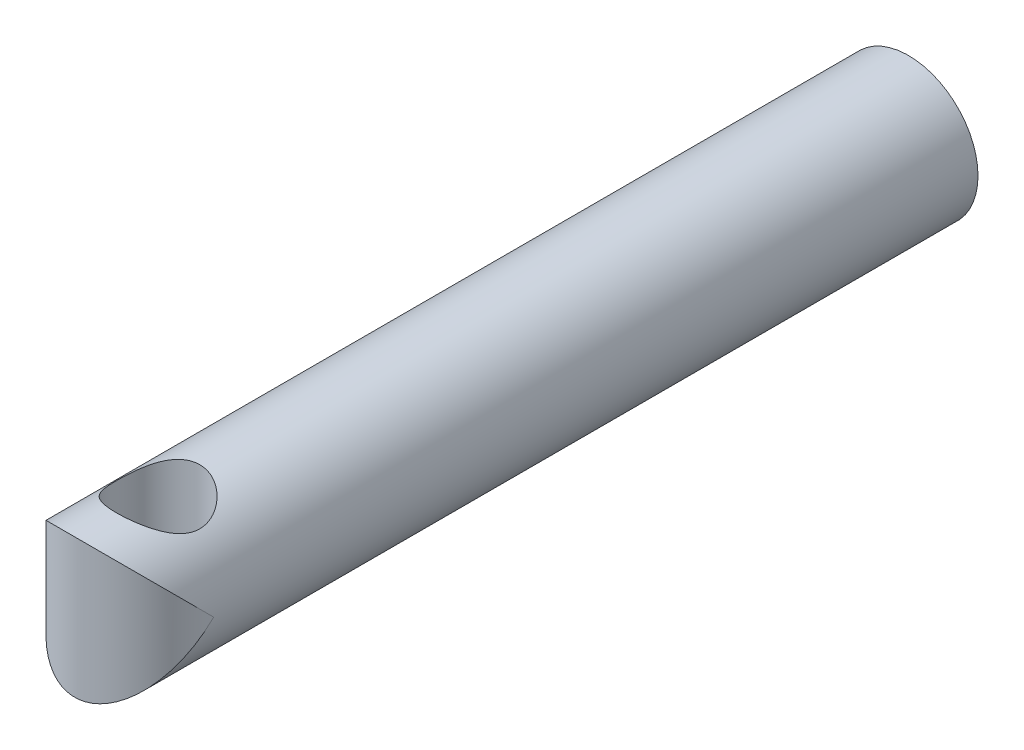
ISO-10303-21;
HEADER;
FILE_DESCRIPTION(('STEP AP214'),'2;1');
FILE_NAME('part.step','',(''),(''),'','','');
FILE_SCHEMA(('AUTOMOTIVE_DESIGN { 1 0 10303 214 1 1 1 1 }'));
ENDSEC;
DATA;
#1=APPLICATION_CONTEXT('core data for automotive mechanical design processes');
#2=APPLICATION_PROTOCOL_DEFINITION('international standard','automotive_design',2000,#1);
#3=PRODUCT_CONTEXT('',#1,'mechanical');
#4=PRODUCT('Part','Part','',(#3));
#5=PRODUCT_RELATED_PRODUCT_CATEGORY('part','',(#4));
#6=PRODUCT_DEFINITION_FORMATION('','',#4);
#7=PRODUCT_DEFINITION_CONTEXT('part definition',#1,'design');
#8=PRODUCT_DEFINITION('design','',#6,#7);
#9=PRODUCT_DEFINITION_SHAPE('','',#8);
#10=(LENGTH_UNIT() NAMED_UNIT(*) SI_UNIT(.MILLI.,.METRE.));
#11=(NAMED_UNIT(*) PLANE_ANGLE_UNIT() SI_UNIT($,.RADIAN.));
#12=(NAMED_UNIT(*) SI_UNIT($,.STERADIAN.) SOLID_ANGLE_UNIT());
#13=UNCERTAINTY_MEASURE_WITH_UNIT(LENGTH_MEASURE(1.E-05),#10,'distance_accuracy_value','');
#14=(GEOMETRIC_REPRESENTATION_CONTEXT(3) GLOBAL_UNCERTAINTY_ASSIGNED_CONTEXT((#13)) GLOBAL_UNIT_ASSIGNED_CONTEXT((#10,
#11,#12)) REPRESENTATION_CONTEXT('',''));
#15=CARTESIAN_POINT('',(0.,0.,0.));
#16=DIRECTION('',(0.,0.,1.));
#17=DIRECTION('',(1.,0.,0.));
#18=AXIS2_PLACEMENT_3D('',#15,#16,#17);
#19=CARTESIAN_POINT('',(0.,0.,30.));
#20=DIRECTION('',(0.,0.,-1.));
#21=DIRECTION('',(-1.,0.,0.));
#22=AXIS2_PLACEMENT_3D('',#19,#20,#21);
#23=CYLINDRICAL_SURFACE('',#22,2.5);
#24=CARTESIAN_POINT('',(0.,-2.5,28.5));
#25=CARTESIAN_POINT('',(0.0767298334620157,-2.49999625789732,28.4999959089901));
#26=CARTESIAN_POINT('',(0.153582320644178,-2.4964290461501,28.4940713290737));
#27=CARTESIAN_POINT('',(0.304975509530679,-2.48249903608568,28.4706756804847));
#28=CARTESIAN_POINT('',(0.379510034596047,-2.47211948032719,28.4531761381458));
#29=CARTESIAN_POINT('',(0.523751827790836,-2.44561558054488,28.4076136388331));
#30=CARTESIAN_POINT('',(0.593481028226565,-2.42951973272944,28.3796030418368));
#31=CARTESIAN_POINT('',(0.727030318214658,-2.39295367626407,28.314139666859));
#32=CARTESIAN_POINT('',(0.790851869416382,-2.37248455380255,28.2766892330313));
#33=CARTESIAN_POINT('',(0.916299278999314,-2.32705360719088,28.1902251732914));
#34=CARTESIAN_POINT('',(0.977384020081414,-2.30186792195985,28.1405463046486));
#35=CARTESIAN_POINT('',(1.09088270411891,-2.25030439279634,28.0325327961717));
#36=CARTESIAN_POINT('',(1.14328534948112,-2.22392505153571,27.9741870628127));
#37=CARTESIAN_POINT('',(1.24444996762974,-2.1691106699591,27.8420764895033));
#38=CARTESIAN_POINT('',(1.29197766378809,-2.14082017703649,27.7672982290187));
#39=CARTESIAN_POINT('',(1.37361437764896,-2.08938301412124,27.6091534267569));
#40=CARTESIAN_POINT('',(1.4077451733516,-2.06622802273938,27.5258011037524));
#41=CARTESIAN_POINT('',(1.45440601714222,-2.0335462966093,27.3734035493468));
#42=CARTESIAN_POINT('',(1.47016197246826,-2.02207883137591,27.3057640013897));
#43=CARTESIAN_POINT('',(1.49216172340475,-2.00590308295503,27.1681962841696));
#44=CARTESIAN_POINT('',(1.49841734556836,-2.00118639643759,27.0982710712455));
#45=CARTESIAN_POINT('',(1.50105508796009,-1.99920922463856,26.9579885057827));
#46=CARTESIAN_POINT('',(1.49741783408419,-2.00196337012718,26.8876305749068));
#47=CARTESIAN_POINT('',(1.48046060478828,-2.01453261443741,26.7487212245724));
#48=CARTESIAN_POINT('',(1.46713334620103,-2.02435302432226,26.6801712041526));
#49=CARTESIAN_POINT('',(1.43173921881793,-2.04953186944258,26.5474697578719));
#50=CARTESIAN_POINT('',(1.40978748666087,-2.06481711652537,26.4832729460755));
#51=CARTESIAN_POINT('',(1.35795061770837,-2.09927051350828,26.3593050090719));
#52=CARTESIAN_POINT('',(1.32806257259705,-2.11844008623465,26.2995355165761));
#53=CARTESIAN_POINT('',(1.25517983184583,-2.16255327268985,26.1750159028772));
#54=CARTESIAN_POINT('',(1.21080724397723,-2.18792043372992,26.1112219070451));
#55=CARTESIAN_POINT('',(1.11291092784003,-2.23930599764381,25.991323516333));
#56=CARTESIAN_POINT('',(1.05937845100579,-2.26532500262149,25.9352265660235));
#57=CARTESIAN_POINT('',(0.93581183438297,-2.31935504958317,25.8243870181782));
#58=CARTESIAN_POINT('',(0.864517682704962,-2.34713836268532,25.770922693984));
#59=CARTESIAN_POINT('',(0.712276050459004,-2.3977242843398,25.6768779528021));
#60=CARTESIAN_POINT('',(0.631333763943567,-2.42052955425515,25.63629064621));
#61=CARTESIAN_POINT('',(0.467197585268208,-2.45730392066151,25.5720678172041));
#62=CARTESIAN_POINT('',(0.384467624173582,-2.47173957439704,25.5475246442841));
#63=CARTESIAN_POINT('',(0.215047895144642,-2.4921884281355,25.5129888025946));
#64=CARTESIAN_POINT('',(0.128363005661321,-2.49821172952738,25.5029786822464));
#65=CARTESIAN_POINT('',(-0.0337146143773942,-2.5009057037461,25.4984921523217));
#66=CARTESIAN_POINT('',(-0.109042473418716,-2.49873521714286,25.5020911449148));
#67=CARTESIAN_POINT('',(-0.257829401986058,-2.48778712087048,25.5204258530719));
#68=CARTESIAN_POINT('',(-0.331288509376104,-2.47900964518037,25.5351613428058));
#69=CARTESIAN_POINT('',(-0.472574932157611,-2.4559479244219,25.5745434328125));
#70=CARTESIAN_POINT('',(-0.540495750928483,-2.44180275662555,25.5989403490735));
#71=CARTESIAN_POINT('',(-0.671265749087262,-2.40913880862845,25.6566773763653));
#72=CARTESIAN_POINT('',(-0.734113924963907,-2.39061916586511,25.6900192513467));
#73=CARTESIAN_POINT('',(-0.860006262823862,-2.3484549623736,25.7685569792087));
#74=CARTESIAN_POINT('',(-0.922394150456835,-2.3244780273988,25.8146238290784));
#75=CARTESIAN_POINT('',(-1.03902603131014,-2.27474265574732,25.9153913934886));
#76=CARTESIAN_POINT('',(-1.09326040273738,-2.24898216586361,25.9701021548525));
#77=CARTESIAN_POINT('',(-1.19931996735579,-2.19445423909891,26.0949103900371));
#78=CARTESIAN_POINT('',(-1.24991019630914,-2.16573241746291,26.1660838854655));
#79=CARTESIAN_POINT('',(-1.33845238915667,-2.1121618206671,26.3172160245682));
#80=CARTESIAN_POINT('',(-1.37641766769781,-2.0873089799769,26.3971652938928));
#81=CARTESIAN_POINT('',(-1.43142578795776,-2.04984909240519,26.5462430223067));
#82=CARTESIAN_POINT('',(-1.4512162533619,-2.03575659328728,26.6139803123586));
#83=CARTESIAN_POINT('',(-1.48113663905972,-2.01409605743544,26.7525320780801));
#84=CARTESIAN_POINT('',(-1.49127995297631,-2.00651897642721,26.8233421443278));
#85=CARTESIAN_POINT('',(-1.50134130416631,-1.99900446616267,26.966376947597));
#86=CARTESIAN_POINT('',(-1.50122089107869,-1.99909576445937,27.038605990687));
#87=CARTESIAN_POINT('',(-1.49066472959328,-2.0069771789285,27.1818944356095));
#88=CARTESIAN_POINT('',(-1.48022337215759,-2.0147714813882,27.2529531800806));
#89=CARTESIAN_POINT('',(-1.45040174148913,-2.0363318524298,27.3884884175722));
#90=CARTESIAN_POINT('',(-1.43147636845351,-2.04979211805581,27.4531170943069));
#91=CARTESIAN_POINT('',(-1.38563242076993,-2.08105501960151,27.5783372544742));
#92=CARTESIAN_POINT('',(-1.35871083588479,-2.09885929040482,27.6389272069606));
#93=CARTESIAN_POINT('',(-1.29289245555732,-2.14012990550917,27.7643198572208));
#94=CARTESIAN_POINT('',(-1.25279167675753,-2.1640458758264,27.8283411038543));
#95=CARTESIAN_POINT('',(-1.16375698389084,-2.21320127030768,27.9493800726173));
#96=CARTESIAN_POINT('',(-1.11481579607798,-2.23844177205021,28.0063919621526));
#97=CARTESIAN_POINT('',(-1.00009777425734,-2.29225690291477,28.1213509491317));
#98=CARTESIAN_POINT('',(-0.932876819313902,-2.32070308663658,28.1779310748962));
#99=CARTESIAN_POINT('',(-0.788462434445587,-2.37365428872367,28.2790978558633));
#100=CARTESIAN_POINT('',(-0.711265444501538,-2.39815789310936,28.3236802119848));
#101=CARTESIAN_POINT('',(-0.551125230801451,-2.43985578654394,28.3977858075737));
#102=CARTESIAN_POINT('',(-0.468430086957211,-2.45725077479787,28.4277280649268));
#103=CARTESIAN_POINT('',(-0.297973306118805,-2.48366273001246,28.472724695211));
#104=CARTESIAN_POINT('',(-0.21023209964861,-2.49271125871485,28.487835167857));
#105=CARTESIAN_POINT('',(-0.101558096917534,-2.49802001168187,28.4966974547087));
#106=CARTESIAN_POINT('',(-0.0812762590282758,-2.49876114656362,28.4979344173061));
#107=CARTESIAN_POINT('',(-0.0406658206871115,-2.49975164517367,28.4995862463709));
#108=CARTESIAN_POINT('',(-0.020337218637569,-2.50000099184316,28.5000010843209));
#109=CARTESIAN_POINT('',(0.,-2.5,28.5));
#110=B_SPLINE_CURVE_WITH_KNOTS('',3,(#24,#25,#26,#27,#28,#29,#30,#31,#32,#33,#34,#35,#36,#37,
#38,#39,#40,#41,#42,#43,#44,#45,#46,#47,#48,#49,#50,#51,#52,#53,#54,#55,#56,#57,#58,#59,#60,#61,
#62,#63,#64,#65,#66,#67,#68,#69,#70,#71,#72,#73,#74,#75,#76,#77,#78,#79,#80,#81,#82,#83,#84,#85,
#86,#87,#88,#89,#90,#91,#92,#93,#94,#95,#96,#97,#98,#99,#100,#101,#102,#103,#104,#105,#106,#107,
#108,#109),.UNSPECIFIED.,.T.,.F.,(4,2,2,2,2,2,2,2,2,2,2,2,2,2,2,2,2,2,2,2,2,2,2,2,2,2,2,2,2,2,2,
2,2,2,2,2,2,2,2,2,2,2,4),(0.,0.230102237548649,0.460772627520012,0.69030888460001,
0.919788197992275,1.16681590732472,1.414162579348,1.69183813189807,1.96906040692091,
2.17933829855633,2.38935420916578,2.59978170870726,2.81036753273872,3.01823267593207,
3.22617409809868,3.47046995225163,3.71500044803674,3.99360957884691,4.27206939275324,
4.53296790696559,4.79355286918236,5.01875602722426,5.24395461863455,5.46367785689772,
5.68344445659025,5.92601365818362,6.16886690081836,6.44336762428009,6.71757792616456,
6.93257787314693,7.14727888733319,7.36278425777433,7.57840681155726,7.78364098331142,
7.98895251523035,8.22578610052287,8.46281544370209,8.7385431177552,9.01436946031986,
9.28175654462678,9.54812832184449,9.60911473335178,9.67010326027641),.UNSPECIFIED.);
#111=CARTESIAN_POINT('',(0.,-2.5,28.5));
#112=VERTEX_POINT('',#111);
#113=EDGE_CURVE('E12',#112,#112,#110,.T.);
#114=ORIENTED_EDGE('',*,*,#113,.T.);
#115=EDGE_LOOP('',(#114));
#116=FACE_BOUND('',#115,.T.);
#117=CARTESIAN_POINT('',(0.,2.5,28.5));
#118=CARTESIAN_POINT('',(-0.0767298334620157,2.49999625789732,28.4999959089901));
#119=CARTESIAN_POINT('',(-0.153582320644178,2.4964290461501,28.4940713290737));
#120=CARTESIAN_POINT('',(-0.304975509530679,2.48249903608568,28.4706756804847));
#121=CARTESIAN_POINT('',(-0.379510034596047,2.47211948032719,28.4531761381458));
#122=CARTESIAN_POINT('',(-0.523751827790836,2.44561558054488,28.4076136388331));
#123=CARTESIAN_POINT('',(-0.593481028226565,2.42951973272944,28.3796030418368));
#124=CARTESIAN_POINT('',(-0.727030318214658,2.39295367626407,28.314139666859));
#125=CARTESIAN_POINT('',(-0.790851869416382,2.37248455380255,28.2766892330313));
#126=CARTESIAN_POINT('',(-0.916299278999314,2.32705360719088,28.1902251732914));
#127=CARTESIAN_POINT('',(-0.977384020081414,2.30186792195985,28.1405463046486));
#128=CARTESIAN_POINT('',(-1.09088270411891,2.25030439279634,28.0325327961717));
#129=CARTESIAN_POINT('',(-1.14328534948112,2.22392505153571,27.9741870628127));
#130=CARTESIAN_POINT('',(-1.24444996762974,2.1691106699591,27.8420764895033));
#131=CARTESIAN_POINT('',(-1.29197766378809,2.14082017703649,27.7672982290187));
#132=CARTESIAN_POINT('',(-1.37361437764896,2.08938301412124,27.6091534267569));
#133=CARTESIAN_POINT('',(-1.4077451733516,2.06622802273938,27.5258011037524));
#134=CARTESIAN_POINT('',(-1.45440601714222,2.0335462966093,27.3734035493468));
#135=CARTESIAN_POINT('',(-1.47016197246826,2.02207883137591,27.3057640013897));
#136=CARTESIAN_POINT('',(-1.49216172340475,2.00590308295503,27.1681962841696));
#137=CARTESIAN_POINT('',(-1.49841734556836,2.00118639643759,27.0982710712455));
#138=CARTESIAN_POINT('',(-1.50105508796009,1.99920922463856,26.9579885057827));
#139=CARTESIAN_POINT('',(-1.49741783408419,2.00196337012718,26.8876305749068));
#140=CARTESIAN_POINT('',(-1.48046060478828,2.01453261443741,26.7487212245724));
#141=CARTESIAN_POINT('',(-1.46713334620103,2.02435302432226,26.6801712041526));
#142=CARTESIAN_POINT('',(-1.43173921881793,2.04953186944258,26.5474697578719));
#143=CARTESIAN_POINT('',(-1.40978748666087,2.06481711652537,26.4832729460755));
#144=CARTESIAN_POINT('',(-1.35795061770837,2.09927051350828,26.3593050090719));
#145=CARTESIAN_POINT('',(-1.32806257259705,2.11844008623465,26.2995355165761));
#146=CARTESIAN_POINT('',(-1.25517983184583,2.16255327268985,26.1750159028772));
#147=CARTESIAN_POINT('',(-1.21080724397723,2.18792043372992,26.1112219070451));
#148=CARTESIAN_POINT('',(-1.11291092784003,2.23930599764381,25.991323516333));
#149=CARTESIAN_POINT('',(-1.05937845100579,2.26532500262149,25.9352265660235));
#150=CARTESIAN_POINT('',(-0.93581183438297,2.31935504958317,25.8243870181782));
#151=CARTESIAN_POINT('',(-0.864517682704962,2.34713836268532,25.770922693984));
#152=CARTESIAN_POINT('',(-0.712276050459004,2.3977242843398,25.6768779528021));
#153=CARTESIAN_POINT('',(-0.631333763943567,2.42052955425515,25.63629064621));
#154=CARTESIAN_POINT('',(-0.467197585268208,2.45730392066151,25.5720678172041));
#155=CARTESIAN_POINT('',(-0.384467624173582,2.47173957439704,25.5475246442841));
#156=CARTESIAN_POINT('',(-0.215047895144642,2.4921884281355,25.5129888025946));
#157=CARTESIAN_POINT('',(-0.128363005661321,2.49821172952738,25.5029786822464));
#158=CARTESIAN_POINT('',(0.0337146143773942,2.5009057037461,25.4984921523217));
#159=CARTESIAN_POINT('',(0.109042473418716,2.49873521714286,25.5020911449148));
#160=CARTESIAN_POINT('',(0.257829401986058,2.48778712087048,25.5204258530719));
#161=CARTESIAN_POINT('',(0.331288509376104,2.47900964518037,25.5351613428058));
#162=CARTESIAN_POINT('',(0.472574932157611,2.4559479244219,25.5745434328125));
#163=CARTESIAN_POINT('',(0.540495750928483,2.44180275662555,25.5989403490735));
#164=CARTESIAN_POINT('',(0.671265749087262,2.40913880862845,25.6566773763653));
#165=CARTESIAN_POINT('',(0.734113924963907,2.39061916586511,25.6900192513467));
#166=CARTESIAN_POINT('',(0.860006262823862,2.3484549623736,25.7685569792087));
#167=CARTESIAN_POINT('',(0.922394150456835,2.3244780273988,25.8146238290784));
#168=CARTESIAN_POINT('',(1.03902603131014,2.27474265574732,25.9153913934886));
#169=CARTESIAN_POINT('',(1.09326040273738,2.24898216586361,25.9701021548525));
#170=CARTESIAN_POINT('',(1.19931996735579,2.19445423909891,26.0949103900371));
#171=CARTESIAN_POINT('',(1.24991019630914,2.16573241746291,26.1660838854655));
#172=CARTESIAN_POINT('',(1.33845238915667,2.1121618206671,26.3172160245682));
#173=CARTESIAN_POINT('',(1.37641766769781,2.0873089799769,26.3971652938928));
#174=CARTESIAN_POINT('',(1.43142578795776,2.04984909240519,26.5462430223067));
#175=CARTESIAN_POINT('',(1.4512162533619,2.03575659328728,26.6139803123586));
#176=CARTESIAN_POINT('',(1.48113663905972,2.01409605743544,26.7525320780801));
#177=CARTESIAN_POINT('',(1.49127995297631,2.00651897642721,26.8233421443278));
#178=CARTESIAN_POINT('',(1.50134130416631,1.99900446616267,26.966376947597));
#179=CARTESIAN_POINT('',(1.50122089107869,1.99909576445937,27.038605990687));
#180=CARTESIAN_POINT('',(1.49066472959328,2.0069771789285,27.1818944356095));
#181=CARTESIAN_POINT('',(1.48022337215759,2.0147714813882,27.2529531800806));
#182=CARTESIAN_POINT('',(1.45040174148913,2.0363318524298,27.3884884175722));
#183=CARTESIAN_POINT('',(1.43147636845351,2.04979211805581,27.4531170943069));
#184=CARTESIAN_POINT('',(1.38563242076993,2.08105501960151,27.5783372544742));
#185=CARTESIAN_POINT('',(1.35871083588479,2.09885929040482,27.6389272069606));
#186=CARTESIAN_POINT('',(1.29289245555732,2.14012990550917,27.7643198572208));
#187=CARTESIAN_POINT('',(1.25279167675753,2.1640458758264,27.8283411038543));
#188=CARTESIAN_POINT('',(1.16375698389084,2.21320127030768,27.9493800726173));
#189=CARTESIAN_POINT('',(1.11481579607798,2.23844177205021,28.0063919621526));
#190=CARTESIAN_POINT('',(1.00009777425734,2.29225690291477,28.1213509491317));
#191=CARTESIAN_POINT('',(0.932876819313902,2.32070308663658,28.1779310748962));
#192=CARTESIAN_POINT('',(0.788462434445587,2.37365428872367,28.2790978558633));
#193=CARTESIAN_POINT('',(0.711265444501538,2.39815789310936,28.3236802119848));
#194=CARTESIAN_POINT('',(0.551125230801451,2.43985578654394,28.3977858075737));
#195=CARTESIAN_POINT('',(0.468430086957211,2.45725077479787,28.4277280649268));
#196=CARTESIAN_POINT('',(0.297973306118805,2.48366273001246,28.472724695211));
#197=CARTESIAN_POINT('',(0.21023209964861,2.49271125871485,28.487835167857));
#198=CARTESIAN_POINT('',(0.101558096917534,2.49802001168187,28.4966974547087));
#199=CARTESIAN_POINT('',(0.0812762590282758,2.49876114656362,28.4979344173061));
#200=CARTESIAN_POINT('',(0.0406658206871115,2.49975164517367,28.4995862463709));
#201=CARTESIAN_POINT('',(0.020337218637569,2.50000099184316,28.5000010843209));
#202=CARTESIAN_POINT('',(0.,2.5,28.5));
#203=B_SPLINE_CURVE_WITH_KNOTS('',3,(#117,#118,#119,#120,#121,#122,#123,#124,#125,#126,#127,
#128,#129,#130,#131,#132,#133,#134,#135,#136,#137,#138,#139,#140,#141,#142,#143,#144,#145,#146,
#147,#148,#149,#150,#151,#152,#153,#154,#155,#156,#157,#158,#159,#160,#161,#162,#163,#164,#165,
#166,#167,#168,#169,#170,#171,#172,#173,#174,#175,#176,#177,#178,#179,#180,#181,#182,#183,#184,
#185,#186,#187,#188,#189,#190,#191,#192,#193,#194,#195,#196,#197,#198,#199,#200,#201,#202),
.UNSPECIFIED.,.T.,.F.,(4,2,2,2,2,2,2,2,2,2,2,2,2,2,2,2,2,2,2,2,2,2,2,2,2,2,2,2,2,2,2,2,2,2,2,2,
2,2,2,2,2,2,4),(0.,0.230102237548649,0.460772627520012,0.69030888460001,0.919788197992275,
1.16681590732472,1.414162579348,1.69183813189807,1.96906040692091,2.17933829855633,
2.38935420916578,2.59978170870726,2.81036753273872,3.01823267593207,3.22617409809868,
3.47046995225163,3.71500044803674,3.99360957884691,4.27206939275324,4.53296790696559,
4.79355286918236,5.01875602722426,5.24395461863455,5.46367785689772,5.68344445659025,
5.92601365818362,6.16886690081836,6.44336762428009,6.71757792616456,6.93257787314693,
7.14727888733319,7.36278425777433,7.57840681155726,7.78364098331142,7.98895251523035,
8.22578610052287,8.46281544370209,8.7385431177552,9.01436946031986,9.28175654462678,
9.54812832184449,9.60911473335178,9.67010326027641),.UNSPECIFIED.);
#204=CARTESIAN_POINT('',(0.,2.5,28.5));
#205=VERTEX_POINT('',#204);
#206=EDGE_CURVE('E131',#205,#205,#203,.T.);
#207=ORIENTED_EDGE('',*,*,#206,.T.);
#208=EDGE_LOOP('',(#207));
#209=FACE_BOUND('',#208,.T.);
#210=CARTESIAN_POINT('',(0.,0.,0.));
#211=DIRECTION('',(0.,0.,1.));
#212=DIRECTION('',(1.,0.,0.));
#213=AXIS2_PLACEMENT_3D('',#210,#211,#212);
#214=CIRCLE('',#213,2.5);
#215=CARTESIAN_POINT('',(2.5,0.,0.));
#216=VERTEX_POINT('',#215);
#217=EDGE_CURVE('E143',#216,#216,#214,.T.);
#218=ORIENTED_EDGE('',*,*,#217,.T.);
#219=EDGE_LOOP('',(#218));
#220=FACE_BOUND('',#219,.T.);
#221=CARTESIAN_POINT('',(0.,0.,27.5));
#222=DIRECTION('',(0.,0.707106781186547,-0.707106781186547));
#223=DIRECTION('',(0.,-0.707106781186547,-0.707106781186547));
#224=AXIS2_PLACEMENT_3D('',#221,#222,#223);
#225=ELLIPSE('',#224,3.53553390593274,2.5);
#226=CARTESIAN_POINT('',(2.5,0.,27.5));
#227=VERTEX_POINT('',#226);
#228=CARTESIAN_POINT('',(-2.5,0.,27.5));
#229=VERTEX_POINT('',#228);
#230=EDGE_CURVE('E137',#227,#229,#225,.F.);
#231=ORIENTED_EDGE('',*,*,#230,.F.);
#232=CARTESIAN_POINT('',(0.,0.,27.5));
#233=DIRECTION('',(0.,-0.707106781186547,-0.707106781186547));
#234=DIRECTION('',(0.,0.707106781186547,-0.707106781186547));
#235=AXIS2_PLACEMENT_3D('',#232,#233,#234);
#236=ELLIPSE('',#235,3.53553390593274,2.5);
#237=EDGE_CURVE('E139',#229,#227,#236,.F.);
#238=ORIENTED_EDGE('',*,*,#237,.F.);
#239=EDGE_LOOP('',(#231,#238));
#240=FACE_BOUND('',#239,.T.);
#241=ADVANCED_FACE('F119',(#116,#209,#220,#240),#23,.T.);
#242=CARTESIAN_POINT('',(0.,0.,0.));
#243=DIRECTION('',(0.,0.,1.));
#244=DIRECTION('',(1.,0.,0.));
#245=AXIS2_PLACEMENT_3D('',#242,#243,#244);
#246=PLANE('',#245);
#247=ORIENTED_EDGE('',*,*,#217,.F.);
#248=EDGE_LOOP('',(#247));
#249=FACE_BOUND('',#248,.T.);
#250=ADVANCED_FACE('F156',(#249),#246,.F.);
#251=CARTESIAN_POINT('',(0.,-2.5,27.5));
#252=DIRECTION('',(0.,1.,0.));
#253=DIRECTION('',(0.,0.,1.));
#254=AXIS2_PLACEMENT_3D('',#251,#252,#253);
#255=CYLINDRICAL_SURFACE('',#254,2.5);
#256=ORIENTED_EDGE('',*,*,#230,.T.);
#257=ORIENTED_EDGE('',*,*,#237,.T.);
#258=EDGE_LOOP('',(#256,#257));
#259=FACE_BOUND('',#258,.T.);
#260=ADVANCED_FACE('F140',(#259),#255,.T.);
#261=CARTESIAN_POINT('',(0.,-2.5,27.));
#262=DIRECTION('',(0.,1.,0.));
#263=DIRECTION('',(0.,0.,1.));
#264=AXIS2_PLACEMENT_3D('',#261,#262,#263);
#265=CYLINDRICAL_SURFACE('',#264,1.5);
#266=ORIENTED_EDGE('',*,*,#206,.F.);
#267=EDGE_LOOP('',(#266));
#268=FACE_BOUND('',#267,.T.);
#269=ORIENTED_EDGE('',*,*,#113,.F.);
#270=EDGE_LOOP('',(#269));
#271=FACE_BOUND('',#270,.T.);
#272=ADVANCED_FACE('F151',(#268,#271),#265,.F.);
#273=CLOSED_SHELL('',(#241,#250,#260,#272));
#274=MANIFOLD_SOLID_BREP('B2',#273);
#275=ADVANCED_BREP_SHAPE_REPRESENTATION('',(#18,#274),#14);
#276=SHAPE_DEFINITION_REPRESENTATION(#9,#275);
ENDSEC;
END-ISO-10303-21;
